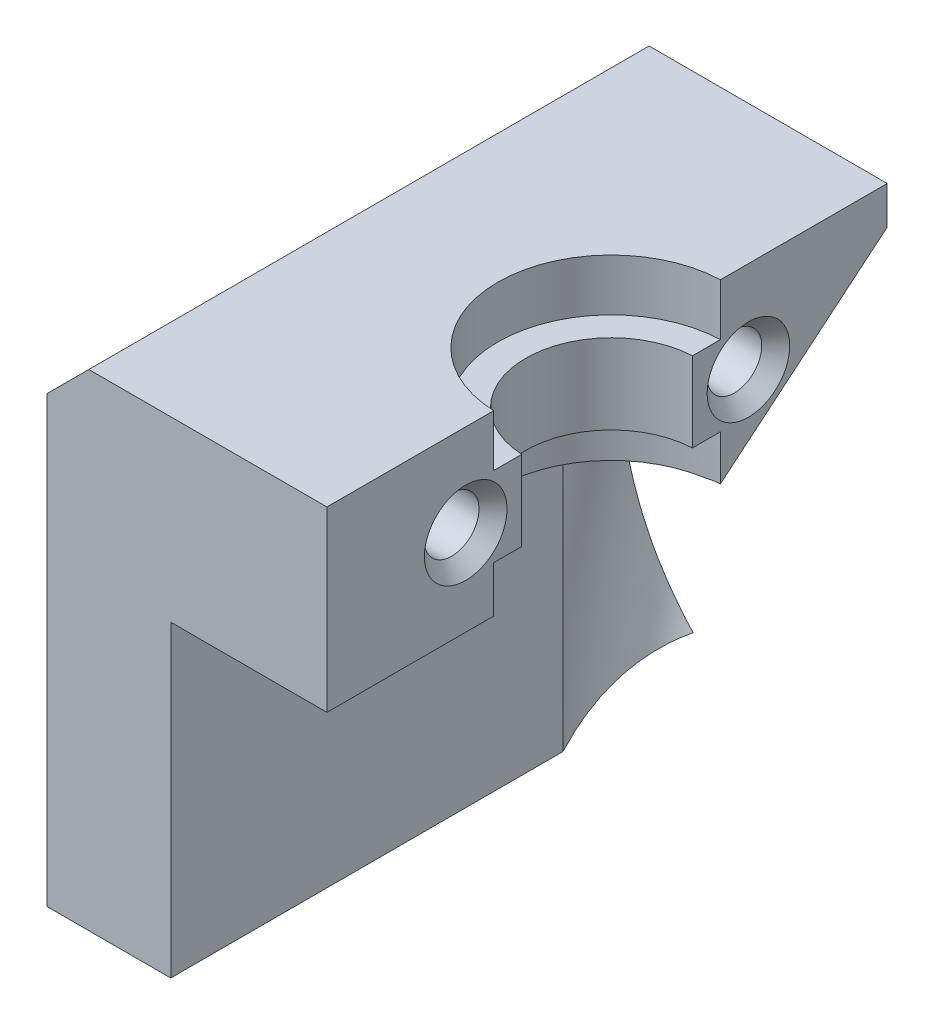
ISO-10303-21;
HEADER;
FILE_DESCRIPTION(('STEP AP214'),'2;1');
FILE_NAME('part.step','',(''),(''),'','','');
FILE_SCHEMA(('AUTOMOTIVE_DESIGN { 1 0 10303 214 1 1 1 1 }'));
ENDSEC;
DATA;
#1=APPLICATION_CONTEXT('core data for automotive mechanical design processes');
#2=APPLICATION_PROTOCOL_DEFINITION('international standard','automotive_design',2000,#1);
#3=PRODUCT_CONTEXT('',#1,'mechanical');
#4=PRODUCT('Part','Part','',(#3));
#5=PRODUCT_RELATED_PRODUCT_CATEGORY('part','',(#4));
#6=PRODUCT_DEFINITION_FORMATION('','',#4);
#7=PRODUCT_DEFINITION_CONTEXT('part definition',#1,'design');
#8=PRODUCT_DEFINITION('design','',#6,#7);
#9=PRODUCT_DEFINITION_SHAPE('','',#8);
#10=(LENGTH_UNIT() NAMED_UNIT(*) SI_UNIT(.MILLI.,.METRE.));
#11=(NAMED_UNIT(*) PLANE_ANGLE_UNIT() SI_UNIT($,.RADIAN.));
#12=(NAMED_UNIT(*) SI_UNIT($,.STERADIAN.) SOLID_ANGLE_UNIT());
#13=UNCERTAINTY_MEASURE_WITH_UNIT(LENGTH_MEASURE(1.E-05),#10,'distance_accuracy_value','');
#14=(GEOMETRIC_REPRESENTATION_CONTEXT(3) GLOBAL_UNCERTAINTY_ASSIGNED_CONTEXT((#13)) GLOBAL_UNIT_ASSIGNED_CONTEXT((#10,
#11,#12)) REPRESENTATION_CONTEXT('',''));
#15=CARTESIAN_POINT('',(0.,0.,0.));
#16=DIRECTION('',(0.,0.,1.));
#17=DIRECTION('',(1.,0.,0.));
#18=AXIS2_PLACEMENT_3D('',#15,#16,#17);
#19=CARTESIAN_POINT('',(0.300000000000002,22.,-20.));
#20=DIRECTION('',(0.,1.,0.));
#21=DIRECTION('',(0.,0.,1.));
#22=AXIS2_PLACEMENT_3D('',#19,#20,#21);
#23=CYLINDRICAL_SURFACE('',#22,8.1);
#24=CARTESIAN_POINT('',(0.300000000000031,25.3,-20.));
#25=DIRECTION('',(0.,1.,0.));
#26=DIRECTION('',(0.,0.,1.));
#27=AXIS2_PLACEMENT_3D('',#24,#25,#26);
#28=CIRCLE('',#27,8.1);
#29=CARTESIAN_POINT('',(0.,25.3,-28.0944425379392));
#30=VERTEX_POINT('',#29);
#31=CARTESIAN_POINT('',(0.,25.3,-11.9055574620608));
#32=VERTEX_POINT('',#31);
#33=EDGE_CURVE('E184',#30,#32,#28,.T.);
#34=ORIENTED_EDGE('',*,*,#33,.T.);
#35=DIRECTION('',(0.,1.,0.));
#36=VECTOR('',#35,1.);
#37=CARTESIAN_POINT('',(0.,22.,-11.9055574620608));
#38=LINE('',#37,#36);
#39=CARTESIAN_POINT('',(0.,22.,-11.9055574620608));
#40=VERTEX_POINT('',#39);
#41=EDGE_CURVE('E177',#40,#32,#38,.T.);
#42=ORIENTED_EDGE('',*,*,#41,.F.);
#43=CARTESIAN_POINT('',(0.300000000000002,22.,-20.));
#44=DIRECTION('',(0.,1.,0.));
#45=DIRECTION('',(0.,0.,1.));
#46=AXIS2_PLACEMENT_3D('',#43,#44,#45);
#47=CIRCLE('',#46,8.1);
#48=CARTESIAN_POINT('',(-0.968857754045006,22.,-28.));
#49=VERTEX_POINT('',#48);
#50=EDGE_CURVE('E318',#49,#40,#47,.T.);
#51=ORIENTED_EDGE('',*,*,#50,.F.);
#52=CARTESIAN_POINT('',(-0.968857754042888,22.,-28.0000000000002));
#53=CARTESIAN_POINT('',(-0.915605100103357,22.0070011041627,-28.0084465129041));
#54=CARTESIAN_POINT('',(-0.86221323228316,22.0135772114821,-28.0163695006825));
#55=CARTESIAN_POINT('',(-0.755255172737131,22.0258571664251,-28.0311484968402));
#56=CARTESIAN_POINT('',(-0.701689305763214,22.0315621583468,-28.0380059051788));
#57=CARTESIAN_POINT('',(-0.594382121085359,22.0420927038707,-28.0506519986151));
#58=CARTESIAN_POINT('',(-0.540640945520169,22.0469188460425,-28.0564413989966));
#59=CARTESIAN_POINT('',(-0.432981229334487,22.0556848007995,-28.0669488540118));
#60=CARTESIAN_POINT('',(-0.379062686846059,22.0596246040198,-28.0716668973256));
#61=CARTESIAN_POINT('',(-0.271048330306685,22.0666101926194,-28.0800272071842));
#62=CARTESIAN_POINT('',(-0.216952422524236,22.069655384371,-28.0836687594236));
#63=CARTESIAN_POINT('',(-0.108582642205884,22.074844506387,-28.0898708918905));
#64=CARTESIAN_POINT('',(-0.0543086283304831,22.0769872234562,-28.0924300170326));
#65=CARTESIAN_POINT('',(0.,22.0786727352224,-28.0944425379392));
#66=B_SPLINE_CURVE_WITH_KNOTS('',3,(#52,#53,#54,#55,#56,#57,#58,#59,#60,#61,#62,#63,#64,#65),
.UNSPECIFIED.,.F.,.F.,(4,2,2,2,2,2,4),(0.,0.163109039514852,0.326001940627923,0.48878534718798,
0.651570473620754,0.814463374886323,0.977574559259879),.UNSPECIFIED.);
#67=CARTESIAN_POINT('',(0.,22.0786727352224,-28.0944425379392));
#68=VERTEX_POINT('',#67);
#69=EDGE_CURVE('E356',#49,#68,#66,.T.);
#70=ORIENTED_EDGE('',*,*,#69,.T.);
#71=DIRECTION('',(0.,1.,0.));
#72=VECTOR('',#71,1.);
#73=CARTESIAN_POINT('',(0.,22.,-28.0944425379392));
#74=LINE('',#73,#72);
#75=EDGE_CURVE('E285',#30,#68,#74,.F.);
#76=ORIENTED_EDGE('',*,*,#75,.F.);
#77=EDGE_LOOP('',(#34,#42,#51,#70,#76));
#78=FACE_BOUND('',#77,.T.);
#79=ADVANCED_FACE('F62',(#78),#23,.F.);
#80=CARTESIAN_POINT('',(0.,0.,0.));
#81=DIRECTION('',(-1.,0.,0.));
#82=DIRECTION('',(0.,0.,1.));
#83=AXIS2_PLACEMENT_3D('',#80,#81,#82);
#84=PLANE('',#83);
#85=CARTESIAN_POINT('',(0.,28.15,-9.90738151530887));
#86=DIRECTION('',(-1.,0.,0.));
#87=DIRECTION('',(0.,0.,1.));
#88=AXIS2_PLACEMENT_3D('',#85,#86,#87);
#89=CIRCLE('',#88,2.95);
#90=CARTESIAN_POINT('',(0.,28.15,-6.95738151530887));
#91=VERTEX_POINT('',#90);
#92=EDGE_CURVE('E448',#91,#91,#89,.T.);
#93=ORIENTED_EDGE('',*,*,#92,.T.);
#94=EDGE_LOOP('',(#93));
#95=FACE_BOUND('',#94,.T.);
#96=DIRECTION('',(0.,-1.,0.));
#97=VECTOR('',#96,1.);
#98=CARTESIAN_POINT('',(0.,0.,0.));
#99=LINE('',#98,#97);
#100=CARTESIAN_POINT('',(0.,34.7,0.));
#101=VERTEX_POINT('',#100);
#102=CARTESIAN_POINT('',(0.,22.,0.));
#103=VERTEX_POINT('',#102);
#104=EDGE_CURVE('E321',#101,#103,#99,.T.);
#105=ORIENTED_EDGE('',*,*,#104,.T.);
#106=DIRECTION('',(0.,0.,1.));
#107=VECTOR('',#106,1.);
#108=CARTESIAN_POINT('',(0.,22.,-40.));
#109=LINE('',#108,#107);
#110=EDGE_CURVE('E292',#40,#103,#109,.T.);
#111=ORIENTED_EDGE('',*,*,#110,.F.);
#112=ORIENTED_EDGE('',*,*,#41,.T.);
#113=DIRECTION('',(0.,0.,1.));
#114=VECTOR('',#113,1.);
#115=CARTESIAN_POINT('',(0.,25.3,-20.));
#116=LINE('',#115,#114);
#117=CARTESIAN_POINT('',(0.,25.3,-13.9073815153089));
#118=VERTEX_POINT('',#117);
#119=EDGE_CURVE('E188',#118,#32,#116,.T.);
#120=ORIENTED_EDGE('',*,*,#119,.F.);
#121=DIRECTION('',(0.,1.,0.));
#122=VECTOR('',#121,1.);
#123=CARTESIAN_POINT('',(0.,25.3,-13.9073815153089));
#124=LINE('',#123,#122);
#125=CARTESIAN_POINT('',(0.,31.,-13.9073815153089));
#126=VERTEX_POINT('',#125);
#127=EDGE_CURVE('E176',#126,#118,#124,.F.);
#128=ORIENTED_EDGE('',*,*,#127,.F.);
#129=DIRECTION('',(0.,0.,1.));
#130=VECTOR('',#129,1.);
#131=CARTESIAN_POINT('',(0.,31.,-20.));
#132=LINE('',#131,#130);
#133=CARTESIAN_POINT('',(0.,31.,-11.9055574620608));
#134=VERTEX_POINT('',#133);
#135=EDGE_CURVE('E186',#126,#134,#132,.T.);
#136=ORIENTED_EDGE('',*,*,#135,.T.);
#137=CARTESIAN_POINT('',(0.,34.7,-11.9055574620608));
#138=VERTEX_POINT('',#137);
#139=EDGE_CURVE('E284',#134,#138,#38,.T.);
#140=ORIENTED_EDGE('',*,*,#139,.T.);
#141=DIRECTION('',(0.,0.,1.));
#142=VECTOR('',#141,1.);
#143=CARTESIAN_POINT('',(0.,34.7,0.));
#144=LINE('',#143,#142);
#145=EDGE_CURVE('E410',#138,#101,#144,.T.);
#146=ORIENTED_EDGE('',*,*,#145,.T.);
#147=EDGE_LOOP('',(#105,#111,#112,#120,#128,#136,#140,#146));
#148=FACE_BOUND('',#147,.T.);
#149=ADVANCED_FACE('F470',(#95,#148),#84,.F.);
#150=CARTESIAN_POINT('',(-20.,0.,0.));
#151=DIRECTION('',(0.,0.,1.));
#152=DIRECTION('',(1.,0.,0.));
#153=AXIS2_PLACEMENT_3D('',#150,#151,#152);
#154=PLANE('',#153);
#155=DIRECTION('',(1.,0.,0.));
#156=VECTOR('',#155,1.);
#157=CARTESIAN_POINT('',(-20.,34.7,0.));
#158=LINE('',#157,#156);
#159=CARTESIAN_POINT('',(-17.,34.7,0.));
#160=VERTEX_POINT('',#159);
#161=EDGE_CURVE('E277',#160,#101,#158,.T.);
#162=ORIENTED_EDGE('',*,*,#161,.F.);
#163=DIRECTION('',(0.707106781186547,0.707106781186548,0.));
#164=VECTOR('',#163,1.);
#165=CARTESIAN_POINT('',(-35.85,15.85,0.));
#166=LINE('',#165,#164);
#167=CARTESIAN_POINT('',(-20.,31.7,0.));
#168=VERTEX_POINT('',#167);
#169=EDGE_CURVE('E85',#160,#168,#166,.F.);
#170=ORIENTED_EDGE('',*,*,#169,.T.);
#171=DIRECTION('',(0.,-1.,0.));
#172=VECTOR('',#171,1.);
#173=CARTESIAN_POINT('',(-20.,0.,0.));
#174=LINE('',#173,#172);
#175=CARTESIAN_POINT('',(-20.,0.,0.));
#176=VERTEX_POINT('',#175);
#177=EDGE_CURVE('E425',#168,#176,#174,.T.);
#178=ORIENTED_EDGE('',*,*,#177,.T.);
#179=DIRECTION('',(1.,0.,0.));
#180=VECTOR('',#179,1.);
#181=CARTESIAN_POINT('',(-20.,0.,0.));
#182=LINE('',#181,#180);
#183=CARTESIAN_POINT('',(-11.15,0.,0.));
#184=VERTEX_POINT('',#183);
#185=EDGE_CURVE('E270',#176,#184,#182,.T.);
#186=ORIENTED_EDGE('',*,*,#185,.T.);
#187=DIRECTION('',(0.,-1.,0.));
#188=VECTOR('',#187,1.);
#189=CARTESIAN_POINT('',(-11.15,63.524962372048,0.));
#190=LINE('',#189,#188);
#191=CARTESIAN_POINT('',(-11.15,22.,0.));
#192=VERTEX_POINT('',#191);
#193=EDGE_CURVE('E310',#192,#184,#190,.T.);
#194=ORIENTED_EDGE('',*,*,#193,.F.);
#195=DIRECTION('',(-1.,0.,0.));
#196=VECTOR('',#195,1.);
#197=CARTESIAN_POINT('',(-11.15,22.,0.));
#198=LINE('',#197,#196);
#199=EDGE_CURVE('E307',#103,#192,#198,.T.);
#200=ORIENTED_EDGE('',*,*,#199,.F.);
#201=ORIENTED_EDGE('',*,*,#104,.F.);
#202=EDGE_LOOP('',(#162,#170,#178,#186,#194,#200,#201));
#203=FACE_BOUND('',#202,.T.);
#204=ADVANCED_FACE('F466',(#203),#154,.T.);
#205=CARTESIAN_POINT('',(-20.,34.7,0.));
#206=DIRECTION('',(0.,1.,0.));
#207=DIRECTION('',(0.,0.,1.));
#208=AXIS2_PLACEMENT_3D('',#205,#206,#207);
#209=PLANE('',#208);
#210=DIRECTION('',(1.,0.,0.));
#211=VECTOR('',#210,1.);
#212=CARTESIAN_POINT('',(-20.,34.7,-40.));
#213=LINE('',#212,#211);
#214=CARTESIAN_POINT('',(-17.,34.7,-40.));
#215=VERTEX_POINT('',#214);
#216=CARTESIAN_POINT('',(0.,34.7,-40.));
#217=VERTEX_POINT('',#216);
#218=EDGE_CURVE('E269',#215,#217,#213,.T.);
#219=ORIENTED_EDGE('',*,*,#218,.F.);
#220=DIRECTION('',(0.,0.,1.));
#221=VECTOR('',#220,1.);
#222=CARTESIAN_POINT('',(-17.,34.7,0.));
#223=LINE('',#222,#221);
#224=EDGE_CURVE('E457',#215,#160,#223,.T.);
#225=ORIENTED_EDGE('',*,*,#224,.T.);
#226=ORIENTED_EDGE('',*,*,#161,.T.);
#227=ORIENTED_EDGE('',*,*,#145,.F.);
#228=CARTESIAN_POINT('',(0.300000000000002,34.7,-20.));
#229=DIRECTION('',(0.,1.,0.));
#230=DIRECTION('',(0.,0.,1.));
#231=AXIS2_PLACEMENT_3D('',#228,#229,#230);
#232=CIRCLE('',#231,8.1);
#233=CARTESIAN_POINT('',(0.,34.7,-28.0944425379392));
#234=VERTEX_POINT('',#233);
#235=EDGE_CURVE('E315',#234,#138,#232,.T.);
#236=ORIENTED_EDGE('',*,*,#235,.F.);
#237=EDGE_CURVE('E412',#217,#234,#144,.T.);
#238=ORIENTED_EDGE('',*,*,#237,.F.);
#239=EDGE_LOOP('',(#219,#225,#226,#227,#236,#238));
#240=FACE_BOUND('',#239,.T.);
#241=ADVANCED_FACE('F248',(#240),#209,.T.);
#242=CARTESIAN_POINT('',(-20.,0.,-40.));
#243=DIRECTION('',(0.,0.,-1.));
#244=DIRECTION('',(-1.,0.,0.));
#245=AXIS2_PLACEMENT_3D('',#242,#243,#244);
#246=PLANE('',#245);
#247=CARTESIAN_POINT('',(-15.9999999999995,29.0000000000009,-40.));
#248=DIRECTION('',(0.,0.,-1.));
#249=DIRECTION('',(-1.,0.,0.));
#250=AXIS2_PLACEMENT_3D('',#247,#248,#249);
#251=CIRCLE('',#250,2.95);
#252=CARTESIAN_POINT('',(-18.9499999999995,29.0000000000009,-40.));
#253=VERTEX_POINT('',#252);
#254=EDGE_CURVE('E454',#253,#253,#251,.F.);
#255=ORIENTED_EDGE('',*,*,#254,.T.);
#256=EDGE_LOOP('',(#255));
#257=FACE_BOUND('',#256,.T.);
#258=DIRECTION('',(0.,1.,0.));
#259=VECTOR('',#258,1.);
#260=CARTESIAN_POINT('',(-20.,0.,-40.));
#261=LINE('',#260,#259);
#262=CARTESIAN_POINT('',(-20.,0.,-40.));
#263=VERTEX_POINT('',#262);
#264=CARTESIAN_POINT('',(-20.,31.7,-40.));
#265=VERTEX_POINT('',#264);
#266=EDGE_CURVE('E281',#263,#265,#261,.T.);
#267=ORIENTED_EDGE('',*,*,#266,.T.);
#268=DIRECTION('',(-0.707106781186547,-0.707106781186548,0.));
#269=VECTOR('',#268,1.);
#270=CARTESIAN_POINT('',(-35.85,15.85,-40.));
#271=LINE('',#270,#269);
#272=EDGE_CURVE('E12',#265,#215,#271,.F.);
#273=ORIENTED_EDGE('',*,*,#272,.T.);
#274=ORIENTED_EDGE('',*,*,#218,.T.);
#275=DIRECTION('',(0.,1.,0.));
#276=VECTOR('',#275,1.);
#277=CARTESIAN_POINT('',(0.,0.,-40.));
#278=LINE('',#277,#276);
#279=CARTESIAN_POINT('',(0.,32.0000000000004,-40.));
#280=VERTEX_POINT('',#279);
#281=EDGE_CURVE('E271',#280,#217,#278,.T.);
#282=ORIENTED_EDGE('',*,*,#281,.F.);
#283=CARTESIAN_POINT('',(0.,13.000000000001,-40.));
#284=DIRECTION('',(0.,0.,-1.));
#285=DIRECTION('',(-1.,0.,0.));
#286=AXIS2_PLACEMENT_3D('',#283,#284,#285);
#287=CIRCLE('',#286,18.9999999999995);
#288=CARTESIAN_POINT('',(-11.2435149608256,28.3161147594846,-40.));
#289=VERTEX_POINT('',#288);
#290=EDGE_CURVE('E211',#289,#280,#287,.T.);
#291=ORIENTED_EDGE('',*,*,#290,.F.);
#292=CARTESIAN_POINT('',(-13.8565201843854,1.62448309876584E-08,-40.));
#293=VERTEX_POINT('',#292);
#294=EDGE_CURVE('E199',#293,#289,#287,.T.);
#295=ORIENTED_EDGE('',*,*,#294,.F.);
#296=DIRECTION('',(1.,0.,0.));
#297=VECTOR('',#296,1.);
#298=CARTESIAN_POINT('',(-20.,0.,-40.));
#299=LINE('',#298,#297);
#300=EDGE_CURVE('E266',#263,#293,#299,.T.);
#301=ORIENTED_EDGE('',*,*,#300,.F.);
#302=EDGE_LOOP('',(#267,#273,#274,#282,#291,#295,#301));
#303=FACE_BOUND('',#302,.T.);
#304=ADVANCED_FACE('F237',(#257,#303),#246,.T.);
#305=CARTESIAN_POINT('',(-20.,0.,0.));
#306=DIRECTION('',(0.,-1.,0.));
#307=DIRECTION('',(0.,0.,-1.));
#308=AXIS2_PLACEMENT_3D('',#305,#306,#307);
#309=PLANE('',#308);
#310=CARTESIAN_POINT('',(-15.575,0.,-26.0926184846911));
#311=DIRECTION('',(0.,-1.,0.));
#312=DIRECTION('',(0.,0.,-1.));
#313=AXIS2_PLACEMENT_3D('',#310,#311,#312);
#314=CIRCLE('',#313,2.95000000000001);
#315=CARTESIAN_POINT('',(-15.575,0.,-29.0426184846911));
#316=VERTEX_POINT('',#315);
#317=EDGE_CURVE('E433',#316,#316,#314,.F.);
#318=ORIENTED_EDGE('',*,*,#317,.T.);
#319=EDGE_LOOP('',(#318));
#320=FACE_BOUND('',#319,.T.);
#321=CARTESIAN_POINT('',(-15.575,0.,-13.9073815153089));
#322=DIRECTION('',(0.,-1.,0.));
#323=DIRECTION('',(0.,0.,-1.));
#324=AXIS2_PLACEMENT_3D('',#321,#322,#323);
#325=CIRCLE('',#324,2.95000000000001);
#326=CARTESIAN_POINT('',(-15.575,0.,-16.8573815153089));
#327=VERTEX_POINT('',#326);
#328=EDGE_CURVE('E430',#327,#327,#325,.F.);
#329=ORIENTED_EDGE('',*,*,#328,.T.);
#330=EDGE_LOOP('',(#329));
#331=FACE_BOUND('',#330,.T.);
#332=CARTESIAN_POINT('',(-11.15,0.,-28.));
#333=CARTESIAN_POINT('',(-11.2821906595453,0.,-28.2509999028098));
#334=CARTESIAN_POINT('',(-11.4117693879561,0.,-28.5033913691538));
#335=CARTESIAN_POINT('',(-11.6651363901277,0.,-29.01110704434));
#336=CARTESIAN_POINT('',(-11.7889238292043,0.,-29.2664316693663));
#337=CARTESIAN_POINT('',(-12.0297916132809,0.,-29.7794273106159));
#338=CARTESIAN_POINT('',(-12.1468884688581,0.,-30.0370905553328));
#339=CARTESIAN_POINT('',(-12.3740430970775,0.,-30.5554988641418));
#340=CARTESIAN_POINT('',(-12.4841010692209,0.,-30.8162438406408));
#341=CARTESIAN_POINT('',(-12.69650134602,0.,-31.3411099503729));
#342=CARTESIAN_POINT('',(-12.7988373923059,0.,-31.605233623427));
#343=CARTESIAN_POINT('',(-12.9948210248159,0.,-32.136689687144));
#344=CARTESIAN_POINT('',(-13.0884687156567,0.,-32.4040220391273));
#345=CARTESIAN_POINT('',(-13.2664442096714,0.,-32.9430510166479));
#346=CARTESIAN_POINT('',(-13.3507307354948,0.,-33.2147613567579));
#347=CARTESIAN_POINT('',(-13.508325338931,0.,-33.7613640145482));
#348=CARTESIAN_POINT('',(-13.5816324823318,0.,-34.0362566008577));
#349=CARTESIAN_POINT('',(-13.7477978348256,0.,-34.7204881116961));
#350=CARTESIAN_POINT('',(-13.8333990374699,0.,-35.1316566974968));
#351=CARTESIAN_POINT('',(-13.9375016552747,0.,-35.7525055147912));
#352=CARTESIAN_POINT('',(-13.9681570848886,0.,-35.9601879172795));
#353=CARTESIAN_POINT('',(-14.020552731043,0.,-36.3768691390575));
#354=CARTESIAN_POINT('',(-14.0422854432799,0.,-36.5858689169377));
#355=CARTESIAN_POINT('',(-14.0757495640125,0.,-37.0030625824883));
#356=CARTESIAN_POINT('',(-14.0875572951155,0.,-37.2112501330573));
#357=CARTESIAN_POINT('',(-14.1004641864887,0.,-37.6279535717695));
#358=CARTESIAN_POINT('',(-14.1015613319649,0.,-37.8364695143091));
#359=CARTESIAN_POINT('',(-14.0871315287238,0.,-38.4611530299461));
#360=CARTESIAN_POINT('',(-14.0539582107347,0.,-38.8772862177409));
#361=CARTESIAN_POINT('',(-13.9747874375549,0.,-39.4082457914455));
#362=CARTESIAN_POINT('',(-13.9546260503904,0.,-39.5271873419733));
#363=CARTESIAN_POINT('',(-13.9093075462319,0.,-39.7642784923751));
#364=CARTESIAN_POINT('',(-13.884143761001,0.,-39.8824268151795));
#365=CARTESIAN_POINT('',(-13.8563773771087,0.,-39.9999999986844));
#366=B_SPLINE_CURVE_WITH_KNOTS('',3,(#332,#333,#334,#335,#336,#337,#338,#339,#340,#341,#342,
#343,#344,#345,#346,#347,#348,#349,#350,#351,#352,#353,#354,#355,#356,#357,#358,#359,#360,#361,
#362,#363,#364,#365),.UNSPECIFIED.,.F.,.F.,(4,2,2,2,2,2,2,2,2,2,2,2,2,2,2,2,4),(0.,
0.851050714595031,1.70222371349137,2.55119644215348,3.40014509793043,4.24977456907194,
5.09939380847328,5.95262194045017,6.80592263058152,8.06460652912933,8.69424960549573,
9.32442115329311,9.94970118862934,10.5750988446237,11.8234053863314,12.185242225203,
12.5475646694181),.UNSPECIFIED.);
#367=CARTESIAN_POINT('',(-11.15,0.,-28.));
#368=VERTEX_POINT('',#367);
#369=EDGE_CURVE('E217',#368,#293,#366,.T.);
#370=ORIENTED_EDGE('',*,*,#369,.F.);
#371=DIRECTION('',(0.,0.,-1.));
#372=VECTOR('',#371,1.);
#373=CARTESIAN_POINT('',(-11.15,0.,-40.));
#374=LINE('',#373,#372);
#375=EDGE_CURVE('E288',#184,#368,#374,.T.);
#376=ORIENTED_EDGE('',*,*,#375,.F.);
#377=ORIENTED_EDGE('',*,*,#185,.F.);
#378=DIRECTION('',(0.,0.,-1.));
#379=VECTOR('',#378,1.);
#380=CARTESIAN_POINT('',(-20.,0.,0.));
#381=LINE('',#380,#379);
#382=EDGE_CURVE('E811',#176,#263,#381,.T.);
#383=ORIENTED_EDGE('',*,*,#382,.T.);
#384=ORIENTED_EDGE('',*,*,#300,.T.);
#385=EDGE_LOOP('',(#370,#376,#377,#383,#384));
#386=FACE_BOUND('',#385,.T.);
#387=ADVANCED_FACE('F247',(#320,#331,#386),#309,.T.);
#388=CARTESIAN_POINT('',(-20.,0.,0.));
#389=DIRECTION('',(-1.,0.,0.));
#390=DIRECTION('',(0.,0.,1.));
#391=AXIS2_PLACEMENT_3D('',#388,#389,#390);
#392=PLANE('',#391);
#393=ORIENTED_EDGE('',*,*,#177,.F.);
#394=DIRECTION('',(0.,0.,-1.));
#395=VECTOR('',#394,1.);
#396=CARTESIAN_POINT('',(-20.,31.7,0.));
#397=LINE('',#396,#395);
#398=EDGE_CURVE('E71',#168,#265,#397,.T.);
#399=ORIENTED_EDGE('',*,*,#398,.T.);
#400=ORIENTED_EDGE('',*,*,#266,.F.);
#401=ORIENTED_EDGE('',*,*,#382,.F.);
#402=EDGE_LOOP('',(#393,#399,#400,#401));
#403=FACE_BOUND('',#402,.T.);
#404=ADVANCED_FACE('F348',(#403),#392,.T.);
#405=CARTESIAN_POINT('',(0.,28.15,-30.0926184846911));
#406=DIRECTION('',(-1.,0.,0.));
#407=DIRECTION('',(0.,0.,1.));
#408=AXIS2_PLACEMENT_3D('',#405,#406,#407);
#409=CIRCLE('',#408,2.95);
#410=CARTESIAN_POINT('',(0.,28.15,-27.1426184846911));
#411=VERTEX_POINT('',#410);
#412=EDGE_CURVE('E442',#411,#411,#409,.T.);
#413=ORIENTED_EDGE('',*,*,#412,.T.);
#414=EDGE_LOOP('',(#413));
#415=FACE_BOUND('',#414,.T.);
#416=CARTESIAN_POINT('',(0.,31.,-28.0944425379392));
#417=VERTEX_POINT('',#416);
#418=EDGE_CURVE('E282',#234,#417,#74,.F.);
#419=ORIENTED_EDGE('',*,*,#418,.T.);
#420=CARTESIAN_POINT('',(0.,31.,-26.0926184846911));
#421=VERTEX_POINT('',#420);
#422=EDGE_CURVE('E171',#417,#421,#132,.T.);
#423=ORIENTED_EDGE('',*,*,#422,.T.);
#424=DIRECTION('',(0.,1.,0.));
#425=VECTOR('',#424,1.);
#426=CARTESIAN_POINT('',(0.,25.3,-26.0926184846911));
#427=LINE('',#426,#425);
#428=CARTESIAN_POINT('',(0.,25.3,-26.0926184846911));
#429=VERTEX_POINT('',#428);
#430=EDGE_CURVE('E165',#429,#421,#427,.T.);
#431=ORIENTED_EDGE('',*,*,#430,.F.);
#432=EDGE_CURVE('E169',#30,#429,#116,.T.);
#433=ORIENTED_EDGE('',*,*,#432,.F.);
#434=ORIENTED_EDGE('',*,*,#75,.T.);
#435=CARTESIAN_POINT('',(0.,22.0786727352224,-28.0944425379392));
#436=CARTESIAN_POINT('',(0.,23.2904734999072,-29.5491152717715));
#437=CARTESIAN_POINT('',(0.,24.5024639117472,-31.0036299689055));
#438=CARTESIAN_POINT('',(0.,26.7620816053209,-33.7150902754978));
#439=CARTESIAN_POINT('',(0.,27.8096877777606,-34.9720534756503));
#440=CARTESIAN_POINT('',(0.,29.9048875824946,-37.4859903264325));
#441=CARTESIAN_POINT('',(0.,30.9524812147889,-38.7429639770622));
#442=CARTESIAN_POINT('',(0.,32.0000000000004,-40.));
#443=B_SPLINE_CURVE_WITH_KNOTS('',3,(#435,#436,#437,#438,#439,#440,#441,#442),.UNSPECIFIED.,.F.,
.F.,(4,2,2,4),(0.,5.67985950001132,10.5887205245308,15.4975815478598),.UNSPECIFIED.);
#444=EDGE_CURVE('E293',#68,#280,#443,.T.);
#445=ORIENTED_EDGE('',*,*,#444,.T.);
#446=ORIENTED_EDGE('',*,*,#281,.T.);
#447=ORIENTED_EDGE('',*,*,#237,.T.);
#448=EDGE_LOOP('',(#419,#423,#431,#433,#434,#445,#446,#447));
#449=FACE_BOUND('',#448,.T.);
#450=ADVANCED_FACE('F168',(#415,#449),#84,.F.);
#451=ORIENTED_EDGE('',*,*,#139,.F.);
#452=CARTESIAN_POINT('',(0.300000000000031,31.,-20.));
#453=DIRECTION('',(0.,1.,0.));
#454=DIRECTION('',(0.,0.,1.));
#455=AXIS2_PLACEMENT_3D('',#452,#453,#454);
#456=CIRCLE('',#455,8.1);
#457=EDGE_CURVE('E191',#417,#134,#456,.T.);
#458=ORIENTED_EDGE('',*,*,#457,.F.);
#459=ORIENTED_EDGE('',*,*,#418,.F.);
#460=ORIENTED_EDGE('',*,*,#235,.T.);
#461=EDGE_LOOP('',(#451,#458,#459,#460));
#462=FACE_BOUND('',#461,.T.);
#463=ADVANCED_FACE('F342',(#462),#23,.F.);
#464=CARTESIAN_POINT('',(0.300000000000002,22.,-20.));
#465=DIRECTION('',(0.,1.,0.));
#466=DIRECTION('',(0.,0.,1.));
#467=AXIS2_PLACEMENT_3D('',#464,#465,#466);
#468=PLANE('',#467);
#469=DIRECTION('',(0.,0.,-1.));
#470=VECTOR('',#469,1.);
#471=CARTESIAN_POINT('',(-11.15,22.,-40.));
#472=LINE('',#471,#470);
#473=CARTESIAN_POINT('',(-11.15,22.,-28.));
#474=VERTEX_POINT('',#473);
#475=EDGE_CURVE('E294',#192,#474,#472,.T.);
#476=ORIENTED_EDGE('',*,*,#475,.T.);
#477=DIRECTION('',(-1.,0.,0.));
#478=VECTOR('',#477,1.);
#479=CARTESIAN_POINT('',(-11.15,22.,-28.));
#480=LINE('',#479,#478);
#481=EDGE_CURVE('E214',#49,#474,#480,.T.);
#482=ORIENTED_EDGE('',*,*,#481,.F.);
#483=ORIENTED_EDGE('',*,*,#50,.T.);
#484=ORIENTED_EDGE('',*,*,#110,.T.);
#485=ORIENTED_EDGE('',*,*,#199,.T.);
#486=EDGE_LOOP('',(#476,#482,#483,#484,#485));
#487=FACE_BOUND('',#486,.T.);
#488=ADVANCED_FACE('F332',(#487),#468,.F.);
#489=CARTESIAN_POINT('',(-11.15,63.524962372048,-40.));
#490=DIRECTION('',(-1.,0.,0.));
#491=DIRECTION('',(0.,0.,1.));
#492=AXIS2_PLACEMENT_3D('',#489,#490,#491);
#493=PLANE('',#492);
#494=ORIENTED_EDGE('',*,*,#375,.T.);
#495=DIRECTION('',(0.,-1.,0.));
#496=VECTOR('',#495,1.);
#497=CARTESIAN_POINT('',(-11.15,22.,-28.));
#498=LINE('',#497,#496);
#499=EDGE_CURVE('E218',#474,#368,#498,.T.);
#500=ORIENTED_EDGE('',*,*,#499,.F.);
#501=ORIENTED_EDGE('',*,*,#475,.F.);
#502=ORIENTED_EDGE('',*,*,#193,.T.);
#503=EDGE_LOOP('',(#494,#500,#501,#502));
#504=FACE_BOUND('',#503,.T.);
#505=ADVANCED_FACE('F341',(#504),#493,.F.);
#506=CARTESIAN_POINT('',(11.2435149608256,28.3161147594846,-40.));
#507=CARTESIAN_POINT('',(11.85,22.,-28.));
#508=CARTESIAN_POINT('',(10.4882212527555,28.8705736571789,-40.));
#509=CARTESIAN_POINT('',(10.8916666666667,22.,-28.));
#510=CARTESIAN_POINT('',(9.6731515607909,29.3825370783367,-40.));
#511=CARTESIAN_POINT('',(9.93333333333333,22.,-28.));
#512=CARTESIAN_POINT('',(7.9391125217985,30.289530780427,-40.));
#513=CARTESIAN_POINT('',(8.01666666666666,22.,-28.));
#514=CARTESIAN_POINT('',(7.02016339542774,30.6844074364991,-40.));
#515=CARTESIAN_POINT('',(7.05833333333332,22.,-28.));
#516=CARTESIAN_POINT('',(5.10494728107103,31.3292245808734,-40.));
#517=CARTESIAN_POINT('',(5.14166666666666,22.,-28.));
#518=CARTESIAN_POINT('',(4.10877662365491,31.5790244620474,-40.));
#519=CARTESIAN_POINT('',(4.18333333333332,22.,-28.));
#520=CARTESIAN_POINT('',(2.07499495682493,31.9144545581838,-40.));
#521=CARTESIAN_POINT('',(2.26666666666666,22.,-28.));
#522=CARTESIAN_POINT('',(1.03754356494492,32.0000000000004,-40.));
#523=CARTESIAN_POINT('',(1.30833333333332,22.,-28.));
#524=CARTESIAN_POINT('',(-1.03754356494493,32.0000000000004,-40.));
#525=CARTESIAN_POINT('',(-0.608333333333345,22.,-28.));
#526=CARTESIAN_POINT('',(-2.07499495682494,31.9144545581838,-40.));
#527=CARTESIAN_POINT('',(-1.56666666666668,22.,-28.));
#528=CARTESIAN_POINT('',(-4.10877662365492,31.5790244620474,-40.));
#529=CARTESIAN_POINT('',(-3.48333333333334,22.,-28.));
#530=CARTESIAN_POINT('',(-5.10494728107104,31.3292245808734,-40.));
#531=CARTESIAN_POINT('',(-4.44166666666667,22.,-28.));
#532=CARTESIAN_POINT('',(-7.02016339542775,30.684407436499,-40.));
#533=CARTESIAN_POINT('',(-6.35833333333334,22.,-28.));
#534=CARTESIAN_POINT('',(-7.93911252179851,30.2895307804269,-40.));
#535=CARTESIAN_POINT('',(-7.31666666666667,22.,-28.));
#536=CARTESIAN_POINT('',(-9.67315156079091,29.3825370783367,-40.));
#537=CARTESIAN_POINT('',(-9.23333333333334,22.,-28.));
#538=CARTESIAN_POINT('',(-10.4882212527555,28.8705736571789,-40.));
#539=CARTESIAN_POINT('',(-10.1916666666667,22.,-28.));
#540=CARTESIAN_POINT('',(-11.2435149608256,28.3161147594846,-40.));
#541=CARTESIAN_POINT('',(-11.15,22.,-28.));
#542=B_SPLINE_SURFACE_WITH_KNOTS('',3,1,((#506,#507),(#508,#509),(#510,#511),(#512,#513),(#514,
#515),(#516,#517),(#518,#519),(#520,#521),(#522,#523),(#524,#525),(#526,#527),(#528,#529),(#530,
#531),(#532,#533),(#534,#535),(#536,#537),(#538,#539),(#540,#541)),.UNSPECIFIED.,.F.,.F.,.F.,(4,
2,2,2,2,2,2,2,4),(2,2),(0.,0.125,0.25,0.375,0.5,0.625,0.75,0.875,1.),(0.,1.),.UNSPECIFIED.);
#543=DIRECTION('',(0.00689585006601469,-0.465754142402837,0.884887295697291));
#544=VECTOR('',#543,1.);
#545=CARTESIAN_POINT('',(-11.1967574804128,25.1580573797423,-34.));
#546=LINE('',#545,#544);
#547=EDGE_CURVE('E213',#289,#474,#546,.T.);
#548=ORIENTED_EDGE('',*,*,#69,.F.);
#549=ORIENTED_EDGE('',*,*,#481,.T.);
#550=ORIENTED_EDGE('',*,*,#547,.F.);
#551=ORIENTED_EDGE('',*,*,#290,.T.);
#552=ORIENTED_EDGE('',*,*,#444,.F.);
#553=EDGE_LOOP('',(#548,#549,#550,#551,#552));
#554=FACE_BOUND('',#553,.T.);
#555=ADVANCED_FACE('F358',(#554),#542,.F.);
#556=CARTESIAN_POINT('',(-11.2435149608256,28.3161147594846,-40.));
#557=CARTESIAN_POINT('',(-11.15,22.,-28.));
#558=CARTESIAN_POINT('',(-12.2723893964645,27.5608210514145,-40.));
#559=CARTESIAN_POINT('',(-11.15,20.694541398992,-28.));
#560=CARTESIAN_POINT('',(-13.2787357272784,26.6616022885569,-40.));
#561=CARTESIAN_POINT('',(-11.15,19.389082797984,-28.));
#562=CARTESIAN_POINT('',(-15.1395564062627,24.5653807298846,-40.));
#563=CARTESIAN_POINT('',(-11.15,16.778165595968,-28.));
#564=CARTESIAN_POINT('',(-15.9931348226862,23.3677796980751,-40.));
#565=CARTESIAN_POINT('',(-11.15,15.47270699496,-28.));
#566=CARTESIAN_POINT('',(-17.427587869698,20.7168904597892,-40.));
#567=CARTESIAN_POINT('',(-11.15,12.861789792944,-28.));
#568=CARTESIAN_POINT('',(-18.0071365149264,19.2637312024859,-40.));
#569=CARTESIAN_POINT('',(-11.15,11.5563311919361,-28.));
#570=CARTESIAN_POINT('',(-18.7938609499361,16.2065689823627,-40.));
#571=CARTESIAN_POINT('',(-11.15,8.94541398992007,-28.));
#572=CARTESIAN_POINT('',(-18.9999999999995,14.6036836371219,-40.));
#573=CARTESIAN_POINT('',(-11.15,7.63995538891207,-28.));
#574=CARTESIAN_POINT('',(-18.9999999999995,11.39631636288,-40.));
#575=CARTESIAN_POINT('',(-11.15,5.02903818689609,-28.));
#576=CARTESIAN_POINT('',(-18.7938609499361,9.79343101763919,-40.));
#577=CARTESIAN_POINT('',(-11.15,3.72357958588809,-28.));
#578=CARTESIAN_POINT('',(-18.0071365149264,6.73626879751604,-40.));
#579=CARTESIAN_POINT('',(-11.15,1.11266238387211,-28.));
#580=CARTESIAN_POINT('',(-17.427587869698,5.28310954021267,-40.));
#581=CARTESIAN_POINT('',(-11.15,-0.192796217135885,-28.));
#582=CARTESIAN_POINT('',(-15.9931348226862,2.63222030192683,-40.));
#583=CARTESIAN_POINT('',(-11.15,-2.80371341915187,-28.));
#584=CARTESIAN_POINT('',(-15.1395564062627,1.43461927011732,-40.));
#585=CARTESIAN_POINT('',(-11.15,-4.10917202015987,-28.));
#586=CARTESIAN_POINT('',(-13.2787357272784,-0.661602288554948,-40.));
#587=CARTESIAN_POINT('',(-11.15,-6.72008922217586,-28.));
#588=CARTESIAN_POINT('',(-12.2723893964645,-1.56082105141258,-40.));
#589=CARTESIAN_POINT('',(-11.15,-8.02554782318385,-28.));
#590=CARTESIAN_POINT('',(-11.2435149608256,-2.31611475948266,-40.));
#591=CARTESIAN_POINT('',(-11.15,-9.33100642419185,-28.));
#592=B_SPLINE_SURFACE_WITH_KNOTS('',3,1,((#556,#557),(#558,#559),(#560,#561),(#562,#563),(#564,
#565),(#566,#567),(#568,#569),(#570,#571),(#572,#573),(#574,#575),(#576,#577),(#578,#579),(#580,
#581),(#582,#583),(#584,#585),(#586,#587),(#588,#589),(#590,#591)),.UNSPECIFIED.,.F.,.F.,.F.,(4,
2,2,2,2,2,2,2,4),(2,2),(0.,0.125,0.25,0.375,0.5,0.625,0.75,0.875,1.),(0.,1.),.UNSPECIFIED.);
#593=ORIENTED_EDGE('',*,*,#369,.T.);
#594=ORIENTED_EDGE('',*,*,#294,.T.);
#595=ORIENTED_EDGE('',*,*,#547,.T.);
#596=ORIENTED_EDGE('',*,*,#499,.T.);
#597=EDGE_LOOP('',(#593,#594,#595,#596));
#598=FACE_BOUND('',#597,.T.);
#599=ADVANCED_FACE('F364',(#598),#592,.F.);
#600=CARTESIAN_POINT('',(0.300000000000031,25.3,-20.));
#601=DIRECTION('',(0.,1.,0.));
#602=DIRECTION('',(0.,0.,1.));
#603=AXIS2_PLACEMENT_3D('',#600,#601,#602);
#604=PLANE('',#603);
#605=ORIENTED_EDGE('',*,*,#33,.F.);
#606=ORIENTED_EDGE('',*,*,#432,.T.);
#607=CARTESIAN_POINT('',(0.300000000000031,25.3,-20.));
#608=DIRECTION('',(0.,1.,0.));
#609=DIRECTION('',(0.,0.,1.));
#610=AXIS2_PLACEMENT_3D('',#607,#608,#609);
#611=CIRCLE('',#610,6.1);
#612=EDGE_CURVE('E182',#429,#118,#611,.T.);
#613=ORIENTED_EDGE('',*,*,#612,.T.);
#614=ORIENTED_EDGE('',*,*,#119,.T.);
#615=EDGE_LOOP('',(#605,#606,#613,#614));
#616=FACE_BOUND('',#615,.T.);
#617=ADVANCED_FACE('F181',(#616),#604,.F.);
#618=CARTESIAN_POINT('',(0.300000000000031,31.,-20.));
#619=DIRECTION('',(0.,1.,0.));
#620=DIRECTION('',(0.,0.,1.));
#621=AXIS2_PLACEMENT_3D('',#618,#619,#620);
#622=PLANE('',#621);
#623=ORIENTED_EDGE('',*,*,#422,.F.);
#624=ORIENTED_EDGE('',*,*,#457,.T.);
#625=ORIENTED_EDGE('',*,*,#135,.F.);
#626=CARTESIAN_POINT('',(0.300000000000031,31.,-20.));
#627=DIRECTION('',(0.,1.,0.));
#628=DIRECTION('',(0.,0.,1.));
#629=AXIS2_PLACEMENT_3D('',#626,#627,#628);
#630=CIRCLE('',#629,6.1);
#631=EDGE_CURVE('E192',#421,#126,#630,.T.);
#632=ORIENTED_EDGE('',*,*,#631,.F.);
#633=EDGE_LOOP('',(#623,#624,#625,#632));
#634=FACE_BOUND('',#633,.T.);
#635=ADVANCED_FACE('F366',(#634),#622,.T.);
#636=CARTESIAN_POINT('',(0.300000000000031,25.3,-20.));
#637=DIRECTION('',(0.,1.,0.));
#638=DIRECTION('',(0.,0.,1.));
#639=AXIS2_PLACEMENT_3D('',#636,#637,#638);
#640=CYLINDRICAL_SURFACE('',#639,6.1);
#641=ORIENTED_EDGE('',*,*,#631,.T.);
#642=ORIENTED_EDGE('',*,*,#127,.T.);
#643=ORIENTED_EDGE('',*,*,#612,.F.);
#644=ORIENTED_EDGE('',*,*,#430,.T.);
#645=EDGE_LOOP('',(#641,#642,#643,#644));
#646=FACE_BOUND('',#645,.T.);
#647=ADVANCED_FACE('F190',(#646),#640,.F.);
#648=CARTESIAN_POINT('',(-15.575,8.,-26.0926184846911));
#649=DIRECTION('',(0.,-1.,0.));
#650=DIRECTION('',(0.,0.,-1.));
#651=AXIS2_PLACEMENT_3D('',#648,#649,#650);
#652=CYLINDRICAL_SURFACE('',#651,1.95);
#653=CARTESIAN_POINT('',(-15.575,1.00000000000001,-26.0926184846911));
#654=DIRECTION('',(0.,-1.,0.));
#655=DIRECTION('',(0.,0.,-1.));
#656=AXIS2_PLACEMENT_3D('',#653,#654,#655);
#657=CIRCLE('',#656,1.95);
#658=CARTESIAN_POINT('',(-15.575,1.00000000000001,-28.0426184846911));
#659=VERTEX_POINT('',#658);
#660=EDGE_CURVE('E427',#659,#659,#657,.T.);
#661=ORIENTED_EDGE('',*,*,#660,.T.);
#662=EDGE_LOOP('',(#661));
#663=FACE_BOUND('',#662,.T.);
#664=CARTESIAN_POINT('',(-15.575,8.,-26.0926184846911));
#665=DIRECTION('',(0.,-1.,0.));
#666=DIRECTION('',(0.,0.,-1.));
#667=AXIS2_PLACEMENT_3D('',#664,#665,#666);
#668=CIRCLE('',#667,1.95);
#669=CARTESIAN_POINT('',(-15.575,8.,-28.0426184846911));
#670=VERTEX_POINT('',#669);
#671=EDGE_CURVE('E509',#670,#670,#668,.T.);
#672=ORIENTED_EDGE('',*,*,#671,.F.);
#673=EDGE_LOOP('',(#672));
#674=FACE_BOUND('',#673,.T.);
#675=ADVANCED_FACE('F529',(#663,#674),#652,.F.);
#676=CARTESIAN_POINT('',(-15.575,8.,-26.0926184846911));
#677=DIRECTION('',(0.,-1.,0.));
#678=DIRECTION('',(0.,0.,-1.));
#679=AXIS2_PLACEMENT_3D('',#676,#677,#678);
#680=PLANE('',#679);
#681=ORIENTED_EDGE('',*,*,#671,.T.);
#682=EDGE_LOOP('',(#681));
#683=FACE_BOUND('',#682,.T.);
#684=ADVANCED_FACE('F537',(#683),#680,.T.);
#685=CARTESIAN_POINT('',(-15.575,8.,-13.9073815153089));
#686=DIRECTION('',(0.,-1.,0.));
#687=DIRECTION('',(0.,0.,-1.));
#688=AXIS2_PLACEMENT_3D('',#685,#686,#687);
#689=CYLINDRICAL_SURFACE('',#688,1.95);
#690=CARTESIAN_POINT('',(-15.575,1.00000000000001,-13.9073815153089));
#691=DIRECTION('',(0.,-1.,0.));
#692=DIRECTION('',(0.,0.,-1.));
#693=AXIS2_PLACEMENT_3D('',#690,#691,#692);
#694=CIRCLE('',#693,1.95);
#695=CARTESIAN_POINT('',(-15.575,1.00000000000001,-15.8573815153089));
#696=VERTEX_POINT('',#695);
#697=EDGE_CURVE('E436',#696,#696,#694,.T.);
#698=ORIENTED_EDGE('',*,*,#697,.T.);
#699=EDGE_LOOP('',(#698));
#700=FACE_BOUND('',#699,.T.);
#701=CARTESIAN_POINT('',(-15.575,8.,-13.9073815153089));
#702=DIRECTION('',(0.,-1.,0.));
#703=DIRECTION('',(0.,0.,-1.));
#704=AXIS2_PLACEMENT_3D('',#701,#702,#703);
#705=CIRCLE('',#704,1.95);
#706=CARTESIAN_POINT('',(-15.575,8.,-15.8573815153089));
#707=VERTEX_POINT('',#706);
#708=EDGE_CURVE('E514',#707,#707,#705,.T.);
#709=ORIENTED_EDGE('',*,*,#708,.F.);
#710=EDGE_LOOP('',(#709));
#711=FACE_BOUND('',#710,.T.);
#712=ADVANCED_FACE('F541',(#700,#711),#689,.F.);
#713=CARTESIAN_POINT('',(-15.575,8.,-13.9073815153089));
#714=DIRECTION('',(0.,-1.,0.));
#715=DIRECTION('',(0.,0.,-1.));
#716=AXIS2_PLACEMENT_3D('',#713,#714,#715);
#717=PLANE('',#716);
#718=ORIENTED_EDGE('',*,*,#708,.T.);
#719=EDGE_LOOP('',(#718));
#720=FACE_BOUND('',#719,.T.);
#721=ADVANCED_FACE('F545',(#720),#717,.T.);
#722=CARTESIAN_POINT('',(-15.575,1.00000000000001,-26.0926184846911));
#723=DIRECTION('',(0.,-1.,0.));
#724=DIRECTION('',(0.,0.,-1.));
#725=AXIS2_PLACEMENT_3D('',#722,#723,#724);
#726=CONICAL_SURFACE('',#725,1.95,0.785398163397448);
#727=ORIENTED_EDGE('',*,*,#317,.F.);
#728=EDGE_LOOP('',(#727));
#729=FACE_BOUND('',#728,.T.);
#730=ORIENTED_EDGE('',*,*,#660,.F.);
#731=EDGE_LOOP('',(#730));
#732=FACE_BOUND('',#731,.T.);
#733=ADVANCED_FACE('F548',(#729,#732),#726,.F.);
#734=CARTESIAN_POINT('',(-15.575,1.00000000000001,-13.9073815153089));
#735=DIRECTION('',(0.,-1.,0.));
#736=DIRECTION('',(0.,0.,-1.));
#737=AXIS2_PLACEMENT_3D('',#734,#735,#736);
#738=CONICAL_SURFACE('',#737,1.95,0.785398163397448);
#739=ORIENTED_EDGE('',*,*,#328,.F.);
#740=EDGE_LOOP('',(#739));
#741=FACE_BOUND('',#740,.T.);
#742=ORIENTED_EDGE('',*,*,#697,.F.);
#743=EDGE_LOOP('',(#742));
#744=FACE_BOUND('',#743,.T.);
#745=ADVANCED_FACE('F499',(#741,#744),#738,.F.);
#746=CARTESIAN_POINT('',(0.00734338885438786,28.15,-30.0926184846911));
#747=DIRECTION('',(-1.,0.,0.));
#748=DIRECTION('',(0.,0.,1.));
#749=AXIS2_PLACEMENT_3D('',#746,#747,#748);
#750=CYLINDRICAL_SURFACE('',#749,1.95);
#751=CARTESIAN_POINT('',(-0.999999999999998,28.15,-30.0926184846911));
#752=DIRECTION('',(-1.,0.,0.));
#753=DIRECTION('',(0.,0.,1.));
#754=AXIS2_PLACEMENT_3D('',#751,#752,#753);
#755=CIRCLE('',#754,1.95);
#756=CARTESIAN_POINT('',(-0.999999999999998,28.15,-28.1426184846911));
#757=VERTEX_POINT('',#756);
#758=EDGE_CURVE('E439',#757,#757,#755,.F.);
#759=ORIENTED_EDGE('',*,*,#758,.T.);
#760=EDGE_LOOP('',(#759));
#761=FACE_BOUND('',#760,.T.);
#762=CARTESIAN_POINT('',(-10.,28.15,-30.0926184846911));
#763=DIRECTION('',(1.,0.,0.));
#764=DIRECTION('',(0.,0.,-1.));
#765=AXIS2_PLACEMENT_3D('',#762,#763,#764);
#766=CIRCLE('',#765,1.95);
#767=CARTESIAN_POINT('',(-10.,28.15,-32.0426184846911));
#768=VERTEX_POINT('',#767);
#769=EDGE_CURVE('E503',#768,#768,#766,.T.);
#770=ORIENTED_EDGE('',*,*,#769,.F.);
#771=EDGE_LOOP('',(#770));
#772=FACE_BOUND('',#771,.T.);
#773=ADVANCED_FACE('F495',(#761,#772),#750,.F.);
#774=CARTESIAN_POINT('',(-10.,28.15,-30.0926184846911));
#775=DIRECTION('',(1.,0.,0.));
#776=DIRECTION('',(0.,0.,-1.));
#777=AXIS2_PLACEMENT_3D('',#774,#775,#776);
#778=PLANE('',#777);
#779=ORIENTED_EDGE('',*,*,#769,.T.);
#780=EDGE_LOOP('',(#779));
#781=FACE_BOUND('',#780,.T.);
#782=ADVANCED_FACE('F498',(#781),#778,.T.);
#783=CARTESIAN_POINT('',(0.00734338885438786,28.15,-9.90738151530887));
#784=DIRECTION('',(-1.,0.,0.));
#785=DIRECTION('',(0.,0.,1.));
#786=AXIS2_PLACEMENT_3D('',#783,#784,#785);
#787=CYLINDRICAL_SURFACE('',#786,1.95);
#788=CARTESIAN_POINT('',(-1.,28.15,-9.90738151530887));
#789=DIRECTION('',(-1.,0.,0.));
#790=DIRECTION('',(0.,0.,1.));
#791=AXIS2_PLACEMENT_3D('',#788,#789,#790);
#792=CIRCLE('',#791,1.95);
#793=CARTESIAN_POINT('',(-1.,28.15,-7.95738151530887));
#794=VERTEX_POINT('',#793);
#795=EDGE_CURVE('E445',#794,#794,#792,.F.);
#796=ORIENTED_EDGE('',*,*,#795,.T.);
#797=EDGE_LOOP('',(#796));
#798=FACE_BOUND('',#797,.T.);
#799=CARTESIAN_POINT('',(-10.,28.15,-9.90738151530887));
#800=DIRECTION('',(1.,0.,0.));
#801=DIRECTION('',(0.,0.,-1.));
#802=AXIS2_PLACEMENT_3D('',#799,#800,#801);
#803=CIRCLE('',#802,1.95);
#804=CARTESIAN_POINT('',(-10.,28.15,-11.8573815153089));
#805=VERTEX_POINT('',#804);
#806=EDGE_CURVE('E505',#805,#805,#803,.T.);
#807=ORIENTED_EDGE('',*,*,#806,.F.);
#808=EDGE_LOOP('',(#807));
#809=FACE_BOUND('',#808,.T.);
#810=ADVANCED_FACE('F553',(#798,#809),#787,.F.);
#811=CARTESIAN_POINT('',(-10.,28.15,-9.90738151530887));
#812=DIRECTION('',(1.,0.,0.));
#813=DIRECTION('',(0.,0.,-1.));
#814=AXIS2_PLACEMENT_3D('',#811,#812,#813);
#815=PLANE('',#814);
#816=ORIENTED_EDGE('',*,*,#806,.T.);
#817=EDGE_LOOP('',(#816));
#818=FACE_BOUND('',#817,.T.);
#819=ADVANCED_FACE('F491',(#818),#815,.T.);
#820=CARTESIAN_POINT('',(-0.999999999999998,28.15,-30.0926184846911));
#821=DIRECTION('',(1.,0.,0.));
#822=DIRECTION('',(0.,0.,-1.));
#823=AXIS2_PLACEMENT_3D('',#820,#821,#822);
#824=CONICAL_SURFACE('',#823,1.95,0.78539816339745);
#825=ORIENTED_EDGE('',*,*,#412,.F.);
#826=EDGE_LOOP('',(#825));
#827=FACE_BOUND('',#826,.T.);
#828=ORIENTED_EDGE('',*,*,#758,.F.);
#829=EDGE_LOOP('',(#828));
#830=FACE_BOUND('',#829,.T.);
#831=ADVANCED_FACE('F487',(#827,#830),#824,.F.);
#832=CARTESIAN_POINT('',(-1.,28.15,-9.90738151530887));
#833=DIRECTION('',(1.,0.,0.));
#834=DIRECTION('',(0.,0.,-1.));
#835=AXIS2_PLACEMENT_3D('',#832,#833,#834);
#836=CONICAL_SURFACE('',#835,1.95,0.785398163397448);
#837=ORIENTED_EDGE('',*,*,#92,.F.);
#838=EDGE_LOOP('',(#837));
#839=FACE_BOUND('',#838,.T.);
#840=ORIENTED_EDGE('',*,*,#795,.F.);
#841=EDGE_LOOP('',(#840));
#842=FACE_BOUND('',#841,.T.);
#843=ADVANCED_FACE('F490',(#839,#842),#836,.F.);
#844=CARTESIAN_POINT('',(-15.9999999999995,29.0000000000009,-30.));
#845=DIRECTION('',(0.,0.,-1.));
#846=DIRECTION('',(-1.,0.,0.));
#847=AXIS2_PLACEMENT_3D('',#844,#845,#846);
#848=CYLINDRICAL_SURFACE('',#847,1.95);
#849=CARTESIAN_POINT('',(-15.9999999999995,29.0000000000009,-39.));
#850=DIRECTION('',(0.,0.,-1.));
#851=DIRECTION('',(-1.,0.,0.));
#852=AXIS2_PLACEMENT_3D('',#849,#850,#851);
#853=CIRCLE('',#852,1.95);
#854=CARTESIAN_POINT('',(-17.9499999999995,29.0000000000009,-39.));
#855=VERTEX_POINT('',#854);
#856=EDGE_CURVE('E451',#855,#855,#853,.T.);
#857=ORIENTED_EDGE('',*,*,#856,.T.);
#858=EDGE_LOOP('',(#857));
#859=FACE_BOUND('',#858,.T.);
#860=CARTESIAN_POINT('',(-15.9999999999995,29.0000000000009,-30.));
#861=DIRECTION('',(0.,0.,-1.));
#862=DIRECTION('',(-1.,0.,0.));
#863=AXIS2_PLACEMENT_3D('',#860,#861,#862);
#864=CIRCLE('',#863,1.95);
#865=CARTESIAN_POINT('',(-17.9499999999995,29.0000000000009,-30.));
#866=VERTEX_POINT('',#865);
#867=EDGE_CURVE('E506',#866,#866,#864,.T.);
#868=ORIENTED_EDGE('',*,*,#867,.F.);
#869=EDGE_LOOP('',(#868));
#870=FACE_BOUND('',#869,.T.);
#871=ADVANCED_FACE('F560',(#859,#870),#848,.F.);
#872=CARTESIAN_POINT('',(-15.9999999999995,29.0000000000009,-30.));
#873=DIRECTION('',(0.,0.,-1.));
#874=DIRECTION('',(-1.,0.,0.));
#875=AXIS2_PLACEMENT_3D('',#872,#873,#874);
#876=PLANE('',#875);
#877=ORIENTED_EDGE('',*,*,#867,.T.);
#878=EDGE_LOOP('',(#877));
#879=FACE_BOUND('',#878,.T.);
#880=ADVANCED_FACE('F563',(#879),#876,.T.);
#881=CARTESIAN_POINT('',(-15.9999999999995,29.0000000000009,-39.));
#882=DIRECTION('',(0.,0.,-1.));
#883=DIRECTION('',(-1.,0.,0.));
#884=AXIS2_PLACEMENT_3D('',#881,#882,#883);
#885=CONICAL_SURFACE('',#884,1.95,0.785398163397452);
#886=ORIENTED_EDGE('',*,*,#254,.F.);
#887=EDGE_LOOP('',(#886));
#888=FACE_BOUND('',#887,.T.);
#889=ORIENTED_EDGE('',*,*,#856,.F.);
#890=EDGE_LOOP('',(#889));
#891=FACE_BOUND('',#890,.T.);
#892=ADVANCED_FACE('F566',(#888,#891),#885,.F.);
#893=CARTESIAN_POINT('',(-17.,34.7,0.));
#894=DIRECTION('',(0.707106781186548,-0.707106781186547,0.));
#895=DIRECTION('',(0.,0.,1.));
#896=AXIS2_PLACEMENT_3D('',#893,#894,#895);
#897=PLANE('',#896);
#898=ORIENTED_EDGE('',*,*,#272,.F.);
#899=ORIENTED_EDGE('',*,*,#398,.F.);
#900=ORIENTED_EDGE('',*,*,#169,.F.);
#901=ORIENTED_EDGE('',*,*,#224,.F.);
#902=EDGE_LOOP('',(#898,#899,#900,#901));
#903=FACE_BOUND('',#902,.T.);
#904=ADVANCED_FACE('F65',(#903),#897,.F.);
#905=CLOSED_SHELL('',(#79,#149,#204,#241,#304,#387,#404,#450,#463,#488,#505,#555,#599,#617,#635,
#647,#675,#684,#712,#721,#733,#745,#773,#782,#810,#819,#831,#843,#871,#880,#892,#904));
#906=MANIFOLD_SOLID_BREP('B2',#905);
#907=ADVANCED_BREP_SHAPE_REPRESENTATION('',(#18,#906),#14);
#908=SHAPE_DEFINITION_REPRESENTATION(#9,#907);
ENDSEC;
END-ISO-10303-21;
